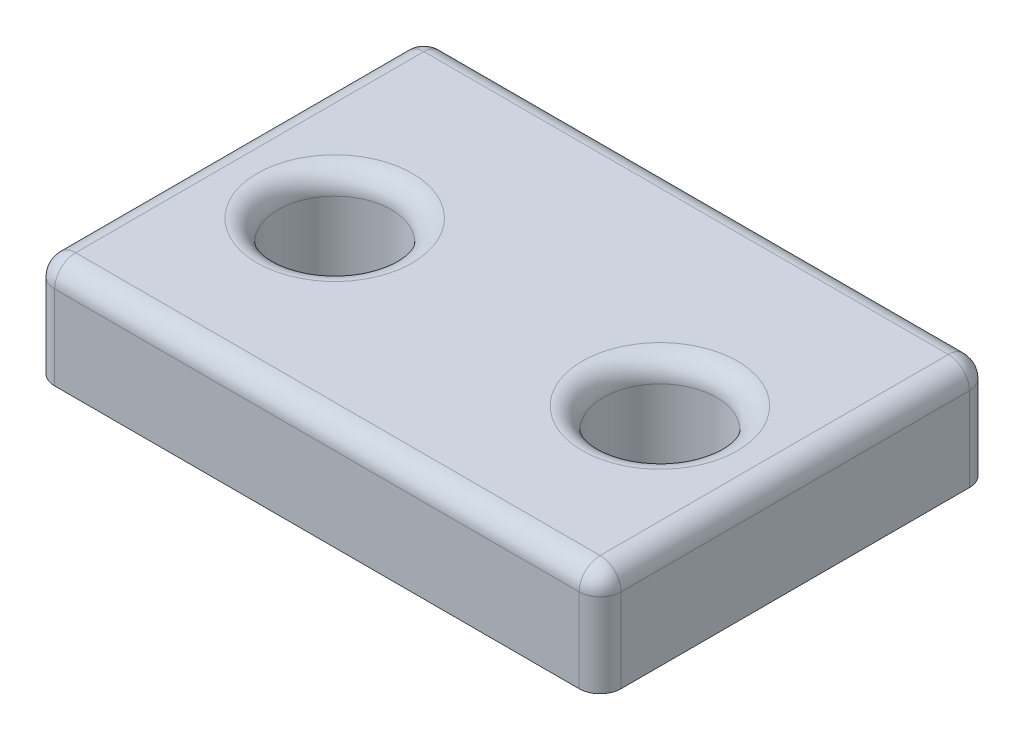
ISO-10303-21;
HEADER;
FILE_DESCRIPTION(('STEP AP214'),'2;1');
FILE_NAME('part.step','',(''),(''),'','','');
FILE_SCHEMA(('AUTOMOTIVE_DESIGN { 1 0 10303 214 1 1 1 1 }'));
ENDSEC;
DATA;
#1=APPLICATION_CONTEXT('core data for automotive mechanical design processes');
#2=APPLICATION_PROTOCOL_DEFINITION('international standard','automotive_design',2000,#1);
#3=PRODUCT_CONTEXT('',#1,'mechanical');
#4=PRODUCT('Part','Part','',(#3));
#5=PRODUCT_RELATED_PRODUCT_CATEGORY('part','',(#4));
#6=PRODUCT_DEFINITION_FORMATION('','',#4);
#7=PRODUCT_DEFINITION_CONTEXT('part definition',#1,'design');
#8=PRODUCT_DEFINITION('design','',#6,#7);
#9=PRODUCT_DEFINITION_SHAPE('','',#8);
#10=(LENGTH_UNIT() NAMED_UNIT(*) SI_UNIT(.MILLI.,.METRE.));
#11=(NAMED_UNIT(*) PLANE_ANGLE_UNIT() SI_UNIT($,.RADIAN.));
#12=(NAMED_UNIT(*) SI_UNIT($,.STERADIAN.) SOLID_ANGLE_UNIT());
#13=UNCERTAINTY_MEASURE_WITH_UNIT(LENGTH_MEASURE(1.E-05),#10,'distance_accuracy_value','');
#14=(GEOMETRIC_REPRESENTATION_CONTEXT(3) GLOBAL_UNCERTAINTY_ASSIGNED_CONTEXT((#13)) GLOBAL_UNIT_ASSIGNED_CONTEXT((#10,
#11,#12)) REPRESENTATION_CONTEXT('',''));
#15=CARTESIAN_POINT('',(0.,0.,0.));
#16=DIRECTION('',(0.,0.,1.));
#17=DIRECTION('',(1.,0.,0.));
#18=AXIS2_PLACEMENT_3D('',#15,#16,#17);
#19=CARTESIAN_POINT('',(0.,5.,0.));
#20=DIRECTION('',(0.,1.,0.));
#21=DIRECTION('',(0.,0.,1.));
#22=AXIS2_PLACEMENT_3D('',#19,#20,#21);
#23=PLANE('',#22);
#24=CARTESIAN_POINT('',(21.25,5.,10.));
#25=DIRECTION('',(0.,1.,0.));
#26=DIRECTION('',(0.,0.,1.));
#27=AXIS2_PLACEMENT_3D('',#24,#25,#26);
#28=CIRCLE('',#27,3.7);
#29=CARTESIAN_POINT('',(21.25,5.,13.7));
#30=VERTEX_POINT('',#29);
#31=EDGE_CURVE('E186',#30,#30,#28,.F.);
#32=ORIENTED_EDGE('',*,*,#31,.T.);
#33=EDGE_LOOP('',(#32));
#34=FACE_BOUND('',#33,.T.);
#35=DIRECTION('',(1.,0.,0.));
#36=VECTOR('',#35,1.);
#37=CARTESIAN_POINT('',(26.,5.,17.6));
#38=LINE('',#37,#36);
#39=CARTESIAN_POINT('',(1.,5.,17.6));
#40=VERTEX_POINT('',#39);
#41=CARTESIAN_POINT('',(26.,5.,17.6));
#42=VERTEX_POINT('',#41);
#43=EDGE_CURVE('E181',#40,#42,#38,.T.);
#44=ORIENTED_EDGE('',*,*,#43,.T.);
#45=DIRECTION('',(0.,0.,-1.));
#46=VECTOR('',#45,1.);
#47=CARTESIAN_POINT('',(26.,5.,1.));
#48=LINE('',#47,#46);
#49=CARTESIAN_POINT('',(26.,5.,1.));
#50=VERTEX_POINT('',#49);
#51=EDGE_CURVE('E183',#42,#50,#48,.T.);
#52=ORIENTED_EDGE('',*,*,#51,.T.);
#53=DIRECTION('',(-1.,0.,0.));
#54=VECTOR('',#53,1.);
#55=CARTESIAN_POINT('',(1.,5.,1.));
#56=LINE('',#55,#54);
#57=CARTESIAN_POINT('',(1.,5.,1.));
#58=VERTEX_POINT('',#57);
#59=EDGE_CURVE('E177',#50,#58,#56,.T.);
#60=ORIENTED_EDGE('',*,*,#59,.T.);
#61=DIRECTION('',(0.,0.,1.));
#62=VECTOR('',#61,1.);
#63=CARTESIAN_POINT('',(1.,5.,17.6));
#64=LINE('',#63,#62);
#65=EDGE_CURVE('E179',#58,#40,#64,.T.);
#66=ORIENTED_EDGE('',*,*,#65,.T.);
#67=EDGE_LOOP('',(#44,#52,#60,#66));
#68=FACE_BOUND('',#67,.T.);
#69=CARTESIAN_POINT('',(5.75,5.,10.));
#70=DIRECTION('',(0.,1.,0.));
#71=DIRECTION('',(0.,0.,1.));
#72=AXIS2_PLACEMENT_3D('',#69,#70,#71);
#73=CIRCLE('',#72,3.7);
#74=CARTESIAN_POINT('',(5.75,5.,13.7));
#75=VERTEX_POINT('',#74);
#76=EDGE_CURVE('E174',#75,#75,#73,.F.);
#77=ORIENTED_EDGE('',*,*,#76,.T.);
#78=EDGE_LOOP('',(#77));
#79=FACE_BOUND('',#78,.T.);
#80=ADVANCED_FACE('F37',(#34,#68,#79),#23,.T.);
#81=CARTESIAN_POINT('',(0.,0.,0.));
#82=DIRECTION('',(0.,1.,0.));
#83=DIRECTION('',(0.,0.,1.));
#84=AXIS2_PLACEMENT_3D('',#81,#82,#83);
#85=PLANE('',#84);
#86=DIRECTION('',(0.,0.,1.));
#87=VECTOR('',#86,1.);
#88=CARTESIAN_POINT('',(0.,0.,0.));
#89=LINE('',#88,#87);
#90=CARTESIAN_POINT('',(0.,0.,1.));
#91=VERTEX_POINT('',#90);
#92=CARTESIAN_POINT('',(0.,0.,17.6));
#93=VERTEX_POINT('',#92);
#94=EDGE_CURVE('E120',#91,#93,#89,.T.);
#95=ORIENTED_EDGE('',*,*,#94,.F.);
#96=CARTESIAN_POINT('',(1.,0.,1.));
#97=DIRECTION('',(0.,1.,0.));
#98=DIRECTION('',(0.,0.,1.));
#99=AXIS2_PLACEMENT_3D('',#96,#97,#98);
#100=CIRCLE('',#99,1.);
#101=CARTESIAN_POINT('',(1.,0.,0.));
#102=VERTEX_POINT('',#101);
#103=EDGE_CURVE('E126',#91,#102,#100,.F.);
#104=ORIENTED_EDGE('',*,*,#103,.T.);
#105=DIRECTION('',(-1.,0.,0.));
#106=VECTOR('',#105,1.);
#107=CARTESIAN_POINT('',(0.,0.,0.));
#108=LINE('',#107,#106);
#109=CARTESIAN_POINT('',(26.,0.,0.));
#110=VERTEX_POINT('',#109);
#111=EDGE_CURVE('E153',#110,#102,#108,.T.);
#112=ORIENTED_EDGE('',*,*,#111,.F.);
#113=CARTESIAN_POINT('',(26.,0.,1.));
#114=DIRECTION('',(0.,1.,0.));
#115=DIRECTION('',(0.,0.,1.));
#116=AXIS2_PLACEMENT_3D('',#113,#114,#115);
#117=CIRCLE('',#116,1.);
#118=CARTESIAN_POINT('',(27.,0.,1.));
#119=VERTEX_POINT('',#118);
#120=EDGE_CURVE('E133',#110,#119,#117,.F.);
#121=ORIENTED_EDGE('',*,*,#120,.T.);
#122=DIRECTION('',(0.,0.,-1.));
#123=VECTOR('',#122,1.);
#124=CARTESIAN_POINT('',(27.,0.,0.));
#125=LINE('',#124,#123);
#126=CARTESIAN_POINT('',(27.,0.,17.6));
#127=VERTEX_POINT('',#126);
#128=EDGE_CURVE('E144',#127,#119,#125,.T.);
#129=ORIENTED_EDGE('',*,*,#128,.F.);
#130=CARTESIAN_POINT('',(26.,0.,17.6));
#131=DIRECTION('',(0.,1.,0.));
#132=DIRECTION('',(0.,0.,1.));
#133=AXIS2_PLACEMENT_3D('',#130,#131,#132);
#134=CIRCLE('',#133,1.);
#135=CARTESIAN_POINT('',(26.,0.,18.6));
#136=VERTEX_POINT('',#135);
#137=EDGE_CURVE('E123',#127,#136,#134,.F.);
#138=ORIENTED_EDGE('',*,*,#137,.T.);
#139=DIRECTION('',(1.,0.,0.));
#140=VECTOR('',#139,1.);
#141=CARTESIAN_POINT('',(0.,0.,18.6));
#142=LINE('',#141,#140);
#143=CARTESIAN_POINT('',(1.,0.,18.6));
#144=VERTEX_POINT('',#143);
#145=EDGE_CURVE('E140',#144,#136,#142,.T.);
#146=ORIENTED_EDGE('',*,*,#145,.F.);
#147=CARTESIAN_POINT('',(1.,0.,17.6));
#148=DIRECTION('',(0.,1.,0.));
#149=DIRECTION('',(0.,0.,1.));
#150=AXIS2_PLACEMENT_3D('',#147,#148,#149);
#151=CIRCLE('',#150,1.);
#152=EDGE_CURVE('E139',#144,#93,#151,.F.);
#153=ORIENTED_EDGE('',*,*,#152,.T.);
#154=EDGE_LOOP('',(#95,#104,#112,#121,#129,#138,#146,#153));
#155=FACE_BOUND('',#154,.T.);
#156=CARTESIAN_POINT('',(5.75,0.,10.));
#157=DIRECTION('',(0.,1.,0.));
#158=DIRECTION('',(0.,0.,1.));
#159=AXIS2_PLACEMENT_3D('',#156,#157,#158);
#160=CIRCLE('',#159,2.7);
#161=CARTESIAN_POINT('',(5.75,0.,12.7));
#162=VERTEX_POINT('',#161);
#163=EDGE_CURVE('E141',#162,#162,#160,.T.);
#164=ORIENTED_EDGE('',*,*,#163,.T.);
#165=EDGE_LOOP('',(#164));
#166=FACE_BOUND('',#165,.T.);
#167=CARTESIAN_POINT('',(21.25,0.,10.));
#168=DIRECTION('',(0.,1.,0.));
#169=DIRECTION('',(0.,0.,1.));
#170=AXIS2_PLACEMENT_3D('',#167,#168,#169);
#171=CIRCLE('',#170,2.7);
#172=CARTESIAN_POINT('',(21.25,0.,12.7));
#173=VERTEX_POINT('',#172);
#174=EDGE_CURVE('E147',#173,#173,#171,.T.);
#175=ORIENTED_EDGE('',*,*,#174,.T.);
#176=EDGE_LOOP('',(#175));
#177=FACE_BOUND('',#176,.T.);
#178=ADVANCED_FACE('F135',(#155,#166,#177),#85,.F.);
#179=CARTESIAN_POINT('',(0.,5.,0.));
#180=DIRECTION('',(1.,0.,0.));
#181=DIRECTION('',(0.,0.,-1.));
#182=AXIS2_PLACEMENT_3D('',#179,#180,#181);
#183=PLANE('',#182);
#184=DIRECTION('',(0.,-1.,0.));
#185=VECTOR('',#184,1.);
#186=CARTESIAN_POINT('',(0.,5.,17.6));
#187=LINE('',#186,#185);
#188=CARTESIAN_POINT('',(0.,4.,17.6));
#189=VERTEX_POINT('',#188);
#190=EDGE_CURVE('E124',#93,#189,#187,.F.);
#191=ORIENTED_EDGE('',*,*,#190,.T.);
#192=DIRECTION('',(0.,0.,1.));
#193=VECTOR('',#192,1.);
#194=CARTESIAN_POINT('',(0.,4.,1.));
#195=LINE('',#194,#193);
#196=CARTESIAN_POINT('',(0.,4.,1.));
#197=VERTEX_POINT('',#196);
#198=EDGE_CURVE('E62',#189,#197,#195,.F.);
#199=ORIENTED_EDGE('',*,*,#198,.T.);
#200=DIRECTION('',(0.,-1.,0.));
#201=VECTOR('',#200,1.);
#202=CARTESIAN_POINT('',(0.,5.,1.));
#203=LINE('',#202,#201);
#204=EDGE_CURVE('E116',#197,#91,#203,.T.);
#205=ORIENTED_EDGE('',*,*,#204,.T.);
#206=ORIENTED_EDGE('',*,*,#94,.T.);
#207=EDGE_LOOP('',(#191,#199,#205,#206));
#208=FACE_BOUND('',#207,.T.);
#209=ADVANCED_FACE('F118',(#208),#183,.F.);
#210=CARTESIAN_POINT('',(0.,5.,18.6));
#211=DIRECTION('',(0.,0.,-1.));
#212=DIRECTION('',(-1.,0.,0.));
#213=AXIS2_PLACEMENT_3D('',#210,#211,#212);
#214=PLANE('',#213);
#215=DIRECTION('',(0.,-1.,0.));
#216=VECTOR('',#215,1.);
#217=CARTESIAN_POINT('',(26.,5.,18.6));
#218=LINE('',#217,#216);
#219=CARTESIAN_POINT('',(26.,4.,18.6));
#220=VERTEX_POINT('',#219);
#221=EDGE_CURVE('E166',#136,#220,#218,.F.);
#222=ORIENTED_EDGE('',*,*,#221,.T.);
#223=DIRECTION('',(1.,0.,0.));
#224=VECTOR('',#223,1.);
#225=CARTESIAN_POINT('',(1.,4.,18.6));
#226=LINE('',#225,#224);
#227=CARTESIAN_POINT('',(1.,4.,18.6));
#228=VERTEX_POINT('',#227);
#229=EDGE_CURVE('E196',#220,#228,#226,.F.);
#230=ORIENTED_EDGE('',*,*,#229,.T.);
#231=DIRECTION('',(0.,-1.,0.));
#232=VECTOR('',#231,1.);
#233=CARTESIAN_POINT('',(1.,5.,18.6));
#234=LINE('',#233,#232);
#235=EDGE_CURVE('E169',#228,#144,#234,.T.);
#236=ORIENTED_EDGE('',*,*,#235,.T.);
#237=ORIENTED_EDGE('',*,*,#145,.T.);
#238=EDGE_LOOP('',(#222,#230,#236,#237));
#239=FACE_BOUND('',#238,.T.);
#240=ADVANCED_FACE('F261',(#239),#214,.F.);
#241=CARTESIAN_POINT('',(27.,5.,0.));
#242=DIRECTION('',(-1.,0.,0.));
#243=DIRECTION('',(0.,0.,1.));
#244=AXIS2_PLACEMENT_3D('',#241,#242,#243);
#245=PLANE('',#244);
#246=DIRECTION('',(0.,-1.,0.));
#247=VECTOR('',#246,1.);
#248=CARTESIAN_POINT('',(27.,5.,1.));
#249=LINE('',#248,#247);
#250=CARTESIAN_POINT('',(27.,4.,1.));
#251=VERTEX_POINT('',#250);
#252=EDGE_CURVE('E163',#119,#251,#249,.F.);
#253=ORIENTED_EDGE('',*,*,#252,.T.);
#254=DIRECTION('',(0.,0.,-1.));
#255=VECTOR('',#254,1.);
#256=CARTESIAN_POINT('',(27.,4.,17.6));
#257=LINE('',#256,#255);
#258=CARTESIAN_POINT('',(27.,4.,17.6));
#259=VERTEX_POINT('',#258);
#260=EDGE_CURVE('E192',#251,#259,#257,.F.);
#261=ORIENTED_EDGE('',*,*,#260,.T.);
#262=DIRECTION('',(0.,-1.,0.));
#263=VECTOR('',#262,1.);
#264=CARTESIAN_POINT('',(27.,5.,17.6));
#265=LINE('',#264,#263);
#266=EDGE_CURVE('E161',#259,#127,#265,.T.);
#267=ORIENTED_EDGE('',*,*,#266,.T.);
#268=ORIENTED_EDGE('',*,*,#128,.T.);
#269=EDGE_LOOP('',(#253,#261,#267,#268));
#270=FACE_BOUND('',#269,.T.);
#271=ADVANCED_FACE('F257',(#270),#245,.F.);
#272=CARTESIAN_POINT('',(0.,5.,0.));
#273=DIRECTION('',(0.,0.,1.));
#274=DIRECTION('',(1.,0.,0.));
#275=AXIS2_PLACEMENT_3D('',#272,#273,#274);
#276=PLANE('',#275);
#277=DIRECTION('',(0.,-1.,0.));
#278=VECTOR('',#277,1.);
#279=CARTESIAN_POINT('',(1.,5.,0.));
#280=LINE('',#279,#278);
#281=CARTESIAN_POINT('',(1.,4.,0.));
#282=VERTEX_POINT('',#281);
#283=EDGE_CURVE('E128',#102,#282,#280,.F.);
#284=ORIENTED_EDGE('',*,*,#283,.T.);
#285=DIRECTION('',(-1.,0.,0.));
#286=VECTOR('',#285,1.);
#287=CARTESIAN_POINT('',(26.,4.,0.));
#288=LINE('',#287,#286);
#289=CARTESIAN_POINT('',(26.,4.,0.));
#290=VERTEX_POINT('',#289);
#291=EDGE_CURVE('E46',#282,#290,#288,.F.);
#292=ORIENTED_EDGE('',*,*,#291,.T.);
#293=DIRECTION('',(0.,-1.,0.));
#294=VECTOR('',#293,1.);
#295=CARTESIAN_POINT('',(26.,5.,0.));
#296=LINE('',#295,#294);
#297=EDGE_CURVE('E132',#290,#110,#296,.T.);
#298=ORIENTED_EDGE('',*,*,#297,.T.);
#299=ORIENTED_EDGE('',*,*,#111,.T.);
#300=EDGE_LOOP('',(#284,#292,#298,#299));
#301=FACE_BOUND('',#300,.T.);
#302=ADVANCED_FACE('F243',(#301),#276,.F.);
#303=CARTESIAN_POINT('',(5.75,5.,10.));
#304=DIRECTION('',(0.,-1.,0.));
#305=DIRECTION('',(0.,0.,-1.));
#306=AXIS2_PLACEMENT_3D('',#303,#304,#305);
#307=CYLINDRICAL_SURFACE('',#306,2.7);
#308=CARTESIAN_POINT('',(5.75,4.,10.));
#309=DIRECTION('',(0.,1.,0.));
#310=DIRECTION('',(0.,0.,1.));
#311=AXIS2_PLACEMENT_3D('',#308,#309,#310);
#312=CIRCLE('',#311,2.7);
#313=CARTESIAN_POINT('',(5.75,4.,12.7));
#314=VERTEX_POINT('',#313);
#315=EDGE_CURVE('E11',#314,#314,#312,.T.);
#316=ORIENTED_EDGE('',*,*,#315,.T.);
#317=EDGE_LOOP('',(#316));
#318=FACE_BOUND('',#317,.T.);
#319=ORIENTED_EDGE('',*,*,#163,.F.);
#320=EDGE_LOOP('',(#319));
#321=FACE_BOUND('',#320,.T.);
#322=ADVANCED_FACE('F234',(#318,#321),#307,.F.);
#323=CARTESIAN_POINT('',(21.25,5.,10.));
#324=DIRECTION('',(0.,-1.,0.));
#325=DIRECTION('',(0.,0.,-1.));
#326=AXIS2_PLACEMENT_3D('',#323,#324,#325);
#327=CYLINDRICAL_SURFACE('',#326,2.7);
#328=CARTESIAN_POINT('',(21.25,4.,10.));
#329=DIRECTION('',(0.,1.,0.));
#330=DIRECTION('',(0.,0.,1.));
#331=AXIS2_PLACEMENT_3D('',#328,#329,#330);
#332=CIRCLE('',#331,2.7);
#333=CARTESIAN_POINT('',(21.25,4.,12.7));
#334=VERTEX_POINT('',#333);
#335=EDGE_CURVE('E171',#334,#334,#332,.T.);
#336=ORIENTED_EDGE('',*,*,#335,.T.);
#337=EDGE_LOOP('',(#336));
#338=FACE_BOUND('',#337,.T.);
#339=ORIENTED_EDGE('',*,*,#174,.F.);
#340=EDGE_LOOP('',(#339));
#341=FACE_BOUND('',#340,.T.);
#342=ADVANCED_FACE('F232',(#338,#341),#327,.F.);
#343=CARTESIAN_POINT('',(1.,5.,1.));
#344=DIRECTION('',(0.,-1.,0.));
#345=DIRECTION('',(0.,0.,-1.));
#346=AXIS2_PLACEMENT_3D('',#343,#344,#345);
#347=CYLINDRICAL_SURFACE('',#346,1.);
#348=ORIENTED_EDGE('',*,*,#204,.F.);
#349=CARTESIAN_POINT('',(1.,4.,1.));
#350=DIRECTION('',(0.,-1.,0.));
#351=DIRECTION('',(0.,0.,-1.));
#352=AXIS2_PLACEMENT_3D('',#349,#350,#351);
#353=CIRCLE('',#352,1.);
#354=EDGE_CURVE('E54',#197,#282,#353,.T.);
#355=ORIENTED_EDGE('',*,*,#354,.T.);
#356=ORIENTED_EDGE('',*,*,#283,.F.);
#357=ORIENTED_EDGE('',*,*,#103,.F.);
#358=EDGE_LOOP('',(#348,#355,#356,#357));
#359=FACE_BOUND('',#358,.T.);
#360=ADVANCED_FACE('F127',(#359),#347,.T.);
#361=CARTESIAN_POINT('',(26.,5.,1.));
#362=DIRECTION('',(0.,-1.,0.));
#363=DIRECTION('',(0.,0.,-1.));
#364=AXIS2_PLACEMENT_3D('',#361,#362,#363);
#365=CYLINDRICAL_SURFACE('',#364,1.);
#366=ORIENTED_EDGE('',*,*,#297,.F.);
#367=CARTESIAN_POINT('',(26.,4.,1.));
#368=DIRECTION('',(0.,-1.,0.));
#369=DIRECTION('',(0.,0.,-1.));
#370=AXIS2_PLACEMENT_3D('',#367,#368,#369);
#371=CIRCLE('',#370,1.);
#372=EDGE_CURVE('E189',#290,#251,#371,.T.);
#373=ORIENTED_EDGE('',*,*,#372,.T.);
#374=ORIENTED_EDGE('',*,*,#252,.F.);
#375=ORIENTED_EDGE('',*,*,#120,.F.);
#376=EDGE_LOOP('',(#366,#373,#374,#375));
#377=FACE_BOUND('',#376,.T.);
#378=ADVANCED_FACE('F241',(#377),#365,.T.);
#379=CARTESIAN_POINT('',(1.,5.,17.6));
#380=DIRECTION('',(0.,-1.,0.));
#381=DIRECTION('',(0.,0.,-1.));
#382=AXIS2_PLACEMENT_3D('',#379,#380,#381);
#383=CYLINDRICAL_SURFACE('',#382,1.);
#384=ORIENTED_EDGE('',*,*,#235,.F.);
#385=CARTESIAN_POINT('',(1.,4.,17.6));
#386=DIRECTION('',(0.,-1.,0.));
#387=DIRECTION('',(0.,0.,-1.));
#388=AXIS2_PLACEMENT_3D('',#385,#386,#387);
#389=CIRCLE('',#388,1.);
#390=EDGE_CURVE('E198',#228,#189,#389,.T.);
#391=ORIENTED_EDGE('',*,*,#390,.T.);
#392=ORIENTED_EDGE('',*,*,#190,.F.);
#393=ORIENTED_EDGE('',*,*,#152,.F.);
#394=EDGE_LOOP('',(#384,#391,#392,#393));
#395=FACE_BOUND('',#394,.T.);
#396=ADVANCED_FACE('F270',(#395),#383,.T.);
#397=CARTESIAN_POINT('',(26.,5.,17.6));
#398=DIRECTION('',(0.,-1.,0.));
#399=DIRECTION('',(0.,0.,-1.));
#400=AXIS2_PLACEMENT_3D('',#397,#398,#399);
#401=CYLINDRICAL_SURFACE('',#400,1.);
#402=ORIENTED_EDGE('',*,*,#266,.F.);
#403=CARTESIAN_POINT('',(26.,4.,17.6));
#404=DIRECTION('',(0.,-1.,0.));
#405=DIRECTION('',(0.,0.,-1.));
#406=AXIS2_PLACEMENT_3D('',#403,#404,#405);
#407=CIRCLE('',#406,1.);
#408=EDGE_CURVE('E194',#259,#220,#407,.T.);
#409=ORIENTED_EDGE('',*,*,#408,.T.);
#410=ORIENTED_EDGE('',*,*,#221,.F.);
#411=ORIENTED_EDGE('',*,*,#137,.F.);
#412=EDGE_LOOP('',(#402,#409,#410,#411));
#413=FACE_BOUND('',#412,.T.);
#414=ADVANCED_FACE('F274',(#413),#401,.T.);
#415=CARTESIAN_POINT('',(21.25,4.,10.));
#416=DIRECTION('',(0.,1.,0.));
#417=DIRECTION('',(0.,0.,1.));
#418=AXIS2_PLACEMENT_3D('',#415,#416,#417);
#419=TOROIDAL_SURFACE('',#418,3.7,1.);
#420=ORIENTED_EDGE('',*,*,#31,.F.);
#421=EDGE_LOOP('',(#420));
#422=FACE_BOUND('',#421,.T.);
#423=ORIENTED_EDGE('',*,*,#335,.F.);
#424=EDGE_LOOP('',(#423));
#425=FACE_BOUND('',#424,.T.);
#426=ADVANCED_FACE('F278',(#422,#425),#419,.T.);
#427=CARTESIAN_POINT('',(1.,4.,17.6));
#428=DIRECTION('',(0.,1.,0.));
#429=DIRECTION('',(0.,0.,1.));
#430=AXIS2_PLACEMENT_3D('',#427,#428,#429);
#431=SPHERICAL_SURFACE('',#430,1.);
#432=CARTESIAN_POINT('',(1.,4.,17.6));
#433=DIRECTION('',(0.,0.,-1.));
#434=DIRECTION('',(-1.,0.,0.));
#435=AXIS2_PLACEMENT_3D('',#432,#433,#434);
#436=CIRCLE('',#435,1.);
#437=EDGE_CURVE('E218',#189,#40,#436,.T.);
#438=ORIENTED_EDGE('',*,*,#437,.F.);
#439=ORIENTED_EDGE('',*,*,#390,.F.);
#440=CARTESIAN_POINT('',(1.,4.,17.6));
#441=DIRECTION('',(1.,0.,0.));
#442=DIRECTION('',(0.,0.,-1.));
#443=AXIS2_PLACEMENT_3D('',#440,#441,#442);
#444=CIRCLE('',#443,1.);
#445=EDGE_CURVE('E41',#40,#228,#444,.T.);
#446=ORIENTED_EDGE('',*,*,#445,.F.);
#447=EDGE_LOOP('',(#438,#439,#446));
#448=FACE_BOUND('',#447,.T.);
#449=ADVANCED_FACE('F282',(#448),#431,.T.);
#450=CARTESIAN_POINT('',(0.,4.,17.6));
#451=DIRECTION('',(-1.,0.,0.));
#452=DIRECTION('',(0.,0.,1.));
#453=AXIS2_PLACEMENT_3D('',#450,#451,#452);
#454=CYLINDRICAL_SURFACE('',#453,1.);
#455=ORIENTED_EDGE('',*,*,#445,.T.);
#456=ORIENTED_EDGE('',*,*,#229,.F.);
#457=CARTESIAN_POINT('',(26.,4.,17.6));
#458=DIRECTION('',(1.,0.,0.));
#459=DIRECTION('',(0.,0.,-1.));
#460=AXIS2_PLACEMENT_3D('',#457,#458,#459);
#461=CIRCLE('',#460,1.);
#462=EDGE_CURVE('E216',#42,#220,#461,.T.);
#463=ORIENTED_EDGE('',*,*,#462,.F.);
#464=ORIENTED_EDGE('',*,*,#43,.F.);
#465=EDGE_LOOP('',(#455,#456,#463,#464));
#466=FACE_BOUND('',#465,.T.);
#467=ADVANCED_FACE('F307',(#466),#454,.T.);
#468=CARTESIAN_POINT('',(1.,4.,0.));
#469=DIRECTION('',(0.,0.,-1.));
#470=DIRECTION('',(-1.,0.,0.));
#471=AXIS2_PLACEMENT_3D('',#468,#469,#470);
#472=CYLINDRICAL_SURFACE('',#471,1.);
#473=ORIENTED_EDGE('',*,*,#437,.T.);
#474=ORIENTED_EDGE('',*,*,#65,.F.);
#475=CARTESIAN_POINT('',(1.,4.,1.));
#476=DIRECTION('',(0.,0.,-1.));
#477=DIRECTION('',(-1.,0.,0.));
#478=AXIS2_PLACEMENT_3D('',#475,#476,#477);
#479=CIRCLE('',#478,1.);
#480=EDGE_CURVE('E213',#197,#58,#479,.T.);
#481=ORIENTED_EDGE('',*,*,#480,.F.);
#482=ORIENTED_EDGE('',*,*,#198,.F.);
#483=EDGE_LOOP('',(#473,#474,#481,#482));
#484=FACE_BOUND('',#483,.T.);
#485=ADVANCED_FACE('F303',(#484),#472,.T.);
#486=CARTESIAN_POINT('',(26.,4.,17.6));
#487=DIRECTION('',(0.,1.,0.));
#488=DIRECTION('',(0.,0.,1.));
#489=AXIS2_PLACEMENT_3D('',#486,#487,#488);
#490=SPHERICAL_SURFACE('',#489,1.);
#491=ORIENTED_EDGE('',*,*,#462,.T.);
#492=ORIENTED_EDGE('',*,*,#408,.F.);
#493=CARTESIAN_POINT('',(26.,4.,17.6));
#494=DIRECTION('',(0.,0.,-1.));
#495=DIRECTION('',(-1.,0.,0.));
#496=AXIS2_PLACEMENT_3D('',#493,#494,#495);
#497=CIRCLE('',#496,1.);
#498=EDGE_CURVE('E210',#42,#259,#497,.T.);
#499=ORIENTED_EDGE('',*,*,#498,.F.);
#500=EDGE_LOOP('',(#491,#492,#499));
#501=FACE_BOUND('',#500,.T.);
#502=ADVANCED_FACE('F299',(#501),#490,.T.);
#503=CARTESIAN_POINT('',(1.,4.,1.));
#504=DIRECTION('',(0.,1.,0.));
#505=DIRECTION('',(0.,0.,1.));
#506=AXIS2_PLACEMENT_3D('',#503,#504,#505);
#507=SPHERICAL_SURFACE('',#506,1.);
#508=ORIENTED_EDGE('',*,*,#354,.F.);
#509=ORIENTED_EDGE('',*,*,#480,.T.);
#510=CARTESIAN_POINT('',(1.,4.,1.));
#511=DIRECTION('',(1.,0.,0.));
#512=DIRECTION('',(0.,0.,-1.));
#513=AXIS2_PLACEMENT_3D('',#510,#511,#512);
#514=CIRCLE('',#513,1.);
#515=EDGE_CURVE('E207',#282,#58,#514,.T.);
#516=ORIENTED_EDGE('',*,*,#515,.F.);
#517=EDGE_LOOP('',(#508,#509,#516));
#518=FACE_BOUND('',#517,.T.);
#519=ADVANCED_FACE('F295',(#518),#507,.T.);
#520=CARTESIAN_POINT('',(26.,4.,0.));
#521=DIRECTION('',(0.,0.,1.));
#522=DIRECTION('',(1.,0.,0.));
#523=AXIS2_PLACEMENT_3D('',#520,#521,#522);
#524=CYLINDRICAL_SURFACE('',#523,1.);
#525=ORIENTED_EDGE('',*,*,#498,.T.);
#526=ORIENTED_EDGE('',*,*,#260,.F.);
#527=CARTESIAN_POINT('',(26.,4.,1.));
#528=DIRECTION('',(0.,0.,-1.));
#529=DIRECTION('',(-1.,0.,0.));
#530=AXIS2_PLACEMENT_3D('',#527,#528,#529);
#531=CIRCLE('',#530,1.);
#532=EDGE_CURVE('E205',#50,#251,#531,.T.);
#533=ORIENTED_EDGE('',*,*,#532,.F.);
#534=ORIENTED_EDGE('',*,*,#51,.F.);
#535=EDGE_LOOP('',(#525,#526,#533,#534));
#536=FACE_BOUND('',#535,.T.);
#537=ADVANCED_FACE('F291',(#536),#524,.T.);
#538=CARTESIAN_POINT('',(0.,4.,1.));
#539=DIRECTION('',(1.,0.,0.));
#540=DIRECTION('',(0.,0.,-1.));
#541=AXIS2_PLACEMENT_3D('',#538,#539,#540);
#542=CYLINDRICAL_SURFACE('',#541,1.);
#543=ORIENTED_EDGE('',*,*,#515,.T.);
#544=ORIENTED_EDGE('',*,*,#59,.F.);
#545=CARTESIAN_POINT('',(26.,4.,1.));
#546=DIRECTION('',(1.,0.,0.));
#547=DIRECTION('',(0.,0.,-1.));
#548=AXIS2_PLACEMENT_3D('',#545,#546,#547);
#549=CIRCLE('',#548,1.);
#550=EDGE_CURVE('E203',#290,#50,#549,.T.);
#551=ORIENTED_EDGE('',*,*,#550,.F.);
#552=ORIENTED_EDGE('',*,*,#291,.F.);
#553=EDGE_LOOP('',(#543,#544,#551,#552));
#554=FACE_BOUND('',#553,.T.);
#555=ADVANCED_FACE('F287',(#554),#542,.T.);
#556=CARTESIAN_POINT('',(26.,4.,1.));
#557=DIRECTION('',(0.,1.,0.));
#558=DIRECTION('',(0.,0.,1.));
#559=AXIS2_PLACEMENT_3D('',#556,#557,#558);
#560=SPHERICAL_SURFACE('',#559,1.);
#561=ORIENTED_EDGE('',*,*,#532,.T.);
#562=ORIENTED_EDGE('',*,*,#372,.F.);
#563=ORIENTED_EDGE('',*,*,#550,.T.);
#564=EDGE_LOOP('',(#561,#562,#563));
#565=FACE_BOUND('',#564,.T.);
#566=ADVANCED_FACE('F284',(#565),#560,.T.);
#567=CARTESIAN_POINT('',(5.75,4.,10.));
#568=DIRECTION('',(0.,1.,0.));
#569=DIRECTION('',(0.,0.,1.));
#570=AXIS2_PLACEMENT_3D('',#567,#568,#569);
#571=TOROIDAL_SURFACE('',#570,3.7,1.);
#572=ORIENTED_EDGE('',*,*,#76,.F.);
#573=EDGE_LOOP('',(#572));
#574=FACE_BOUND('',#573,.T.);
#575=ORIENTED_EDGE('',*,*,#315,.F.);
#576=EDGE_LOOP('',(#575));
#577=FACE_BOUND('',#576,.T.);
#578=ADVANCED_FACE('F39',(#574,#577),#571,.T.);
#579=CLOSED_SHELL('',(#80,#178,#209,#240,#271,#302,#322,#342,#360,#378,#396,#414,#426,#449,#467,
#485,#502,#519,#537,#555,#566,#578));
#580=MANIFOLD_SOLID_BREP('B2',#579);
#581=ADVANCED_BREP_SHAPE_REPRESENTATION('',(#18,#580),#14);
#582=SHAPE_DEFINITION_REPRESENTATION(#9,#581);
ENDSEC;
END-ISO-10303-21;
